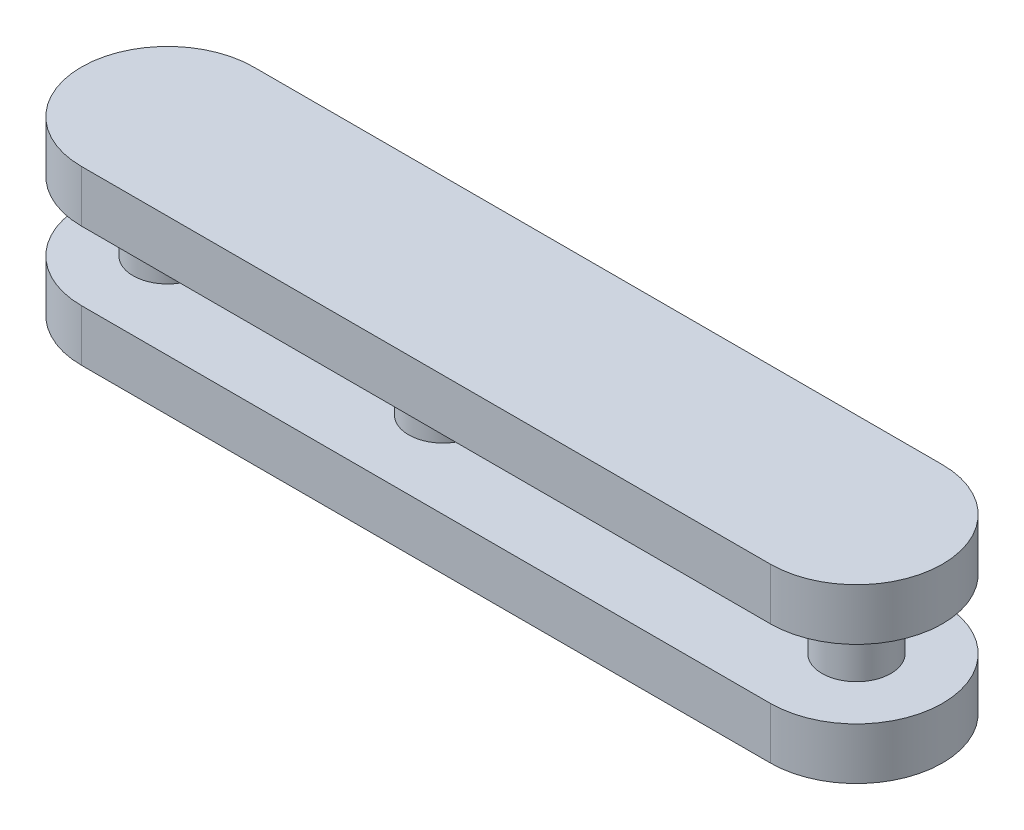
ISO-10303-21;
HEADER;
FILE_DESCRIPTION(('STEP AP214'),'2;1');
FILE_NAME('part.step','',(''),(''),'','','');
FILE_SCHEMA(('AUTOMOTIVE_DESIGN { 1 0 10303 214 1 1 1 1 }'));
ENDSEC;
DATA;
#1=APPLICATION_CONTEXT('core data for automotive mechanical design processes');
#2=APPLICATION_PROTOCOL_DEFINITION('international standard','automotive_design',2000,#1);
#3=PRODUCT_CONTEXT('',#1,'mechanical');
#4=PRODUCT('Part','Part','',(#3));
#5=PRODUCT_RELATED_PRODUCT_CATEGORY('part','',(#4));
#6=PRODUCT_DEFINITION_FORMATION('','',#4);
#7=PRODUCT_DEFINITION_CONTEXT('part definition',#1,'design');
#8=PRODUCT_DEFINITION('design','',#6,#7);
#9=PRODUCT_DEFINITION_SHAPE('','',#8);
#10=(LENGTH_UNIT() NAMED_UNIT(*) SI_UNIT(.MILLI.,.METRE.));
#11=(NAMED_UNIT(*) PLANE_ANGLE_UNIT() SI_UNIT($,.RADIAN.));
#12=(NAMED_UNIT(*) SI_UNIT($,.STERADIAN.) SOLID_ANGLE_UNIT());
#13=UNCERTAINTY_MEASURE_WITH_UNIT(LENGTH_MEASURE(1.E-05),#10,'distance_accuracy_value','');
#14=(GEOMETRIC_REPRESENTATION_CONTEXT(3) GLOBAL_UNCERTAINTY_ASSIGNED_CONTEXT((#13)) GLOBAL_UNIT_ASSIGNED_CONTEXT((#10,
#11,#12)) REPRESENTATION_CONTEXT('',''));
#15=CARTESIAN_POINT('',(0.,0.,0.));
#16=DIRECTION('',(0.,0.,1.));
#17=DIRECTION('',(1.,0.,0.));
#18=AXIS2_PLACEMENT_3D('',#15,#16,#17);
#19=CARTESIAN_POINT('',(21.,2.,-5.));
#20=DIRECTION('',(0.,1.,0.));
#21=DIRECTION('',(0.,0.,1.));
#22=AXIS2_PLACEMENT_3D('',#19,#20,#21);
#23=CYLINDRICAL_SURFACE('',#22,2.);
#24=CARTESIAN_POINT('',(21.,7.,-5.));
#25=DIRECTION('',(0.,1.,0.));
#26=DIRECTION('',(0.,0.,1.));
#27=AXIS2_PLACEMENT_3D('',#24,#25,#26);
#28=CIRCLE('',#27,2.);
#29=CARTESIAN_POINT('',(21.,7.,-3.));
#30=VERTEX_POINT('',#29);
#31=EDGE_CURVE('E41',#30,#30,#28,.F.);
#32=ORIENTED_EDGE('',*,*,#31,.T.);
#33=EDGE_LOOP('',(#32));
#34=FACE_BOUND('',#33,.T.);
#35=CARTESIAN_POINT('',(21.,3.,-5.));
#36=DIRECTION('',(0.,-1.,0.));
#37=DIRECTION('',(1.,0.,0.));
#38=AXIS2_PLACEMENT_3D('',#35,#36,#37);
#39=CIRCLE('',#38,2.);
#40=CARTESIAN_POINT('',(23.,3.,-5.));
#41=VERTEX_POINT('',#40);
#42=EDGE_CURVE('E11',#41,#41,#39,.T.);
#43=ORIENTED_EDGE('',*,*,#42,.F.);
#44=EDGE_LOOP('',(#43));
#45=FACE_BOUND('',#44,.T.);
#46=ADVANCED_FACE('F33',(#34,#45),#23,.T.);
#47=CARTESIAN_POINT('',(0.,10.,0.));
#48=DIRECTION('',(0.,0.,-1.));
#49=DIRECTION('',(-1.,0.,0.));
#50=AXIS2_PLACEMENT_3D('',#47,#48,#49);
#51=PLANE('',#50);
#52=DIRECTION('',(1.,0.,0.));
#53=VECTOR('',#52,1.);
#54=CARTESIAN_POINT('',(0.,10.,0.));
#55=LINE('',#54,#53);
#56=CARTESIAN_POINT('',(5.,10.,0.));
#57=VERTEX_POINT('',#56);
#58=CARTESIAN_POINT('',(45.,10.,0.));
#59=VERTEX_POINT('',#58);
#60=EDGE_CURVE('E153',#57,#59,#55,.T.);
#61=ORIENTED_EDGE('',*,*,#60,.F.);
#62=DIRECTION('',(0.,1.,0.));
#63=VECTOR('',#62,1.);
#64=CARTESIAN_POINT('',(5.,0.,0.));
#65=LINE('',#64,#63);
#66=CARTESIAN_POINT('',(5.,7.,0.));
#67=VERTEX_POINT('',#66);
#68=EDGE_CURVE('E135',#67,#57,#65,.T.);
#69=ORIENTED_EDGE('',*,*,#68,.F.);
#70=DIRECTION('',(-1.,0.,0.));
#71=VECTOR('',#70,1.);
#72=CARTESIAN_POINT('',(0.,7.,0.));
#73=LINE('',#72,#71);
#74=CARTESIAN_POINT('',(45.,7.,0.));
#75=VERTEX_POINT('',#74);
#76=EDGE_CURVE('E152',#75,#67,#73,.T.);
#77=ORIENTED_EDGE('',*,*,#76,.F.);
#78=DIRECTION('',(0.,1.,0.));
#79=VECTOR('',#78,1.);
#80=CARTESIAN_POINT('',(45.,0.,0.));
#81=LINE('',#80,#79);
#82=EDGE_CURVE('E56',#75,#59,#81,.T.);
#83=ORIENTED_EDGE('',*,*,#82,.T.);
#84=EDGE_LOOP('',(#61,#69,#77,#83));
#85=FACE_BOUND('',#84,.T.);
#86=ADVANCED_FACE('F35',(#85),#51,.F.);
#87=CARTESIAN_POINT('',(0.,10.,-10.));
#88=DIRECTION('',(0.,0.,1.));
#89=DIRECTION('',(1.,0.,0.));
#90=AXIS2_PLACEMENT_3D('',#87,#88,#89);
#91=PLANE('',#90);
#92=DIRECTION('',(0.,1.,0.));
#93=VECTOR('',#92,1.);
#94=CARTESIAN_POINT('',(5.,0.,-10.));
#95=LINE('',#94,#93);
#96=CARTESIAN_POINT('',(5.,6.99999999999999,-10.));
#97=VERTEX_POINT('',#96);
#98=CARTESIAN_POINT('',(5.,10.,-10.));
#99=VERTEX_POINT('',#98);
#100=EDGE_CURVE('E48',#97,#99,#95,.T.);
#101=ORIENTED_EDGE('',*,*,#100,.T.);
#102=DIRECTION('',(-1.,0.,0.));
#103=VECTOR('',#102,1.);
#104=CARTESIAN_POINT('',(0.,10.,-10.));
#105=LINE('',#104,#103);
#106=CARTESIAN_POINT('',(45.,10.,-10.));
#107=VERTEX_POINT('',#106);
#108=EDGE_CURVE('E149',#107,#99,#105,.T.);
#109=ORIENTED_EDGE('',*,*,#108,.F.);
#110=DIRECTION('',(0.,1.,0.));
#111=VECTOR('',#110,1.);
#112=CARTESIAN_POINT('',(45.,0.,-10.));
#113=LINE('',#112,#111);
#114=CARTESIAN_POINT('',(45.,7.,-10.));
#115=VERTEX_POINT('',#114);
#116=EDGE_CURVE('E134',#115,#107,#113,.T.);
#117=ORIENTED_EDGE('',*,*,#116,.F.);
#118=DIRECTION('',(-1.,0.,0.));
#119=VECTOR('',#118,1.);
#120=CARTESIAN_POINT('',(50.,7.,-10.));
#121=LINE('',#120,#119);
#122=EDGE_CURVE('E138',#115,#97,#121,.T.);
#123=ORIENTED_EDGE('',*,*,#122,.T.);
#124=EDGE_LOOP('',(#101,#109,#117,#123));
#125=FACE_BOUND('',#124,.T.);
#126=ADVANCED_FACE('F193',(#125),#91,.F.);
#127=CARTESIAN_POINT('',(0.,10.,0.));
#128=DIRECTION('',(0.,-1.,0.));
#129=DIRECTION('',(0.,0.,-1.));
#130=AXIS2_PLACEMENT_3D('',#127,#128,#129);
#131=PLANE('',#130);
#132=ORIENTED_EDGE('',*,*,#108,.T.);
#133=CARTESIAN_POINT('',(5.,10.,-5.));
#134=DIRECTION('',(0.,-1.,0.));
#135=DIRECTION('',(0.,0.,1.));
#136=AXIS2_PLACEMENT_3D('',#133,#134,#135);
#137=CIRCLE('',#136,5.);
#138=EDGE_CURVE('E132',#57,#99,#137,.T.);
#139=ORIENTED_EDGE('',*,*,#138,.F.);
#140=ORIENTED_EDGE('',*,*,#60,.T.);
#141=CARTESIAN_POINT('',(45.,10.,-5.));
#142=DIRECTION('',(0.,-1.,0.));
#143=DIRECTION('',(0.,0.,-1.));
#144=AXIS2_PLACEMENT_3D('',#141,#142,#143);
#145=CIRCLE('',#144,5.);
#146=EDGE_CURVE('E140',#107,#59,#145,.T.);
#147=ORIENTED_EDGE('',*,*,#146,.F.);
#148=EDGE_LOOP('',(#132,#139,#140,#147));
#149=FACE_BOUND('',#148,.T.);
#150=ADVANCED_FACE('F178',(#149),#131,.F.);
#151=CARTESIAN_POINT('',(0.,7.,-10.));
#152=DIRECTION('',(0.,1.,0.));
#153=DIRECTION('',(0.,0.,1.));
#154=AXIS2_PLACEMENT_3D('',#151,#152,#153);
#155=PLANE('',#154);
#156=ORIENTED_EDGE('',*,*,#31,.F.);
#157=EDGE_LOOP('',(#156));
#158=FACE_BOUND('',#157,.T.);
#159=CARTESIAN_POINT('',(45.,7.,-5.));
#160=DIRECTION('',(0.,1.,0.));
#161=DIRECTION('',(0.,0.,1.));
#162=AXIS2_PLACEMENT_3D('',#159,#160,#161);
#163=CIRCLE('',#162,2.);
#164=CARTESIAN_POINT('',(45.,7.,-3.));
#165=VERTEX_POINT('',#164);
#166=EDGE_CURVE('E163',#165,#165,#163,.F.);
#167=ORIENTED_EDGE('',*,*,#166,.F.);
#168=EDGE_LOOP('',(#167));
#169=FACE_BOUND('',#168,.T.);
#170=CARTESIAN_POINT('',(5.,7.,-5.));
#171=DIRECTION('',(0.,1.,0.));
#172=DIRECTION('',(0.,0.,1.));
#173=AXIS2_PLACEMENT_3D('',#170,#171,#172);
#174=CIRCLE('',#173,2.);
#175=CARTESIAN_POINT('',(5.,7.,-3.));
#176=VERTEX_POINT('',#175);
#177=EDGE_CURVE('E158',#176,#176,#174,.F.);
#178=ORIENTED_EDGE('',*,*,#177,.F.);
#179=EDGE_LOOP('',(#178));
#180=FACE_BOUND('',#179,.T.);
#181=ORIENTED_EDGE('',*,*,#76,.T.);
#182=CARTESIAN_POINT('',(5.,7.,-5.));
#183=DIRECTION('',(0.,1.,0.));
#184=DIRECTION('',(0.,0.,1.));
#185=AXIS2_PLACEMENT_3D('',#182,#183,#184);
#186=CIRCLE('',#185,5.);
#187=EDGE_CURVE('E168',#67,#97,#186,.F.);
#188=ORIENTED_EDGE('',*,*,#187,.T.);
#189=ORIENTED_EDGE('',*,*,#122,.F.);
#190=CARTESIAN_POINT('',(45.,7.,-5.));
#191=DIRECTION('',(0.,1.,0.));
#192=DIRECTION('',(0.,0.,1.));
#193=AXIS2_PLACEMENT_3D('',#190,#191,#192);
#194=CIRCLE('',#193,5.);
#195=EDGE_CURVE('E166',#115,#75,#194,.F.);
#196=ORIENTED_EDGE('',*,*,#195,.T.);
#197=EDGE_LOOP('',(#181,#188,#189,#196));
#198=FACE_BOUND('',#197,.T.);
#199=ADVANCED_FACE('F174',(#158,#169,#180,#198),#155,.F.);
#200=CARTESIAN_POINT('',(5.,7.99999999999999,-5.));
#201=DIRECTION('',(0.,-1.,0.));
#202=DIRECTION('',(0.,0.,-1.));
#203=AXIS2_PLACEMENT_3D('',#200,#201,#202);
#204=CYLINDRICAL_SURFACE('',#203,2.);
#205=CARTESIAN_POINT('',(5.,2.99999999999999,-5.));
#206=DIRECTION('',(0.,1.,0.));
#207=DIRECTION('',(0.,0.,1.));
#208=AXIS2_PLACEMENT_3D('',#205,#206,#207);
#209=CIRCLE('',#208,2.);
#210=CARTESIAN_POINT('',(5.,2.99999999999999,-3.));
#211=VERTEX_POINT('',#210);
#212=EDGE_CURVE('E142',#211,#211,#209,.T.);
#213=ORIENTED_EDGE('',*,*,#212,.T.);
#214=EDGE_LOOP('',(#213));
#215=FACE_BOUND('',#214,.T.);
#216=ORIENTED_EDGE('',*,*,#177,.T.);
#217=EDGE_LOOP('',(#216));
#218=FACE_BOUND('',#217,.T.);
#219=ADVANCED_FACE('F177',(#215,#218),#204,.T.);
#220=CARTESIAN_POINT('',(45.,7.99999999999999,-5.));
#221=DIRECTION('',(0.,-1.,0.));
#222=DIRECTION('',(0.,0.,-1.));
#223=AXIS2_PLACEMENT_3D('',#220,#221,#222);
#224=CYLINDRICAL_SURFACE('',#223,2.);
#225=CARTESIAN_POINT('',(45.,2.99999999999999,-5.));
#226=DIRECTION('',(0.,1.,0.));
#227=DIRECTION('',(0.,0.,1.));
#228=AXIS2_PLACEMENT_3D('',#225,#226,#227);
#229=CIRCLE('',#228,2.);
#230=CARTESIAN_POINT('',(45.,2.99999999999999,-3.));
#231=VERTEX_POINT('',#230);
#232=EDGE_CURVE('E131',#231,#231,#229,.T.);
#233=ORIENTED_EDGE('',*,*,#232,.T.);
#234=EDGE_LOOP('',(#233));
#235=FACE_BOUND('',#234,.T.);
#236=ORIENTED_EDGE('',*,*,#166,.T.);
#237=EDGE_LOOP('',(#236));
#238=FACE_BOUND('',#237,.T.);
#239=ADVANCED_FACE('F198',(#235,#238),#224,.T.);
#240=CARTESIAN_POINT('',(45.,0.,-5.));
#241=DIRECTION('',(0.,1.,0.));
#242=DIRECTION('',(0.,0.,1.));
#243=AXIS2_PLACEMENT_3D('',#240,#241,#242);
#244=CYLINDRICAL_SURFACE('',#243,5.);
#245=ORIENTED_EDGE('',*,*,#146,.T.);
#246=ORIENTED_EDGE('',*,*,#82,.F.);
#247=ORIENTED_EDGE('',*,*,#195,.F.);
#248=ORIENTED_EDGE('',*,*,#116,.T.);
#249=EDGE_LOOP('',(#245,#246,#247,#248));
#250=FACE_BOUND('',#249,.T.);
#251=ADVANCED_FACE('F196',(#250),#244,.T.);
#252=CARTESIAN_POINT('',(5.,0.,-5.));
#253=DIRECTION('',(0.,1.,0.));
#254=DIRECTION('',(0.,0.,1.));
#255=AXIS2_PLACEMENT_3D('',#252,#253,#254);
#256=CYLINDRICAL_SURFACE('',#255,5.);
#257=ORIENTED_EDGE('',*,*,#138,.T.);
#258=ORIENTED_EDGE('',*,*,#100,.F.);
#259=ORIENTED_EDGE('',*,*,#187,.F.);
#260=ORIENTED_EDGE('',*,*,#68,.T.);
#261=EDGE_LOOP('',(#257,#258,#259,#260));
#262=FACE_BOUND('',#261,.T.);
#263=ADVANCED_FACE('F189',(#262),#256,.T.);
#264=CARTESIAN_POINT('',(50.,3.,-10.));
#265=DIRECTION('',(0.,-1.,0.));
#266=DIRECTION('',(1.,0.,0.));
#267=AXIS2_PLACEMENT_3D('',#264,#265,#266);
#268=PLANE('',#267);
#269=ORIENTED_EDGE('',*,*,#42,.T.);
#270=EDGE_LOOP('',(#269));
#271=FACE_BOUND('',#270,.T.);
#272=DIRECTION('',(1.,0.,0.));
#273=VECTOR('',#272,1.);
#274=CARTESIAN_POINT('',(0.,3.,-10.));
#275=LINE('',#274,#273);
#276=CARTESIAN_POINT('',(5.,2.99999999999999,-10.));
#277=VERTEX_POINT('',#276);
#278=CARTESIAN_POINT('',(45.,3.,-10.));
#279=VERTEX_POINT('',#278);
#280=EDGE_CURVE('E126',#277,#279,#275,.T.);
#281=ORIENTED_EDGE('',*,*,#280,.F.);
#282=CARTESIAN_POINT('',(5.,2.99999999999999,-5.));
#283=DIRECTION('',(0.,-1.,0.));
#284=DIRECTION('',(1.,0.,0.));
#285=AXIS2_PLACEMENT_3D('',#282,#283,#284);
#286=CIRCLE('',#285,5.);
#287=CARTESIAN_POINT('',(5.,2.99999999999999,0.));
#288=VERTEX_POINT('',#287);
#289=EDGE_CURVE('E103',#277,#288,#286,.F.);
#290=ORIENTED_EDGE('',*,*,#289,.T.);
#291=DIRECTION('',(1.,0.,0.));
#292=VECTOR('',#291,1.);
#293=CARTESIAN_POINT('',(50.,3.,0.));
#294=LINE('',#293,#292);
#295=CARTESIAN_POINT('',(45.,3.,0.));
#296=VERTEX_POINT('',#295);
#297=EDGE_CURVE('E342',#288,#296,#294,.T.);
#298=ORIENTED_EDGE('',*,*,#297,.T.);
#299=CARTESIAN_POINT('',(45.,3.,-5.));
#300=DIRECTION('',(0.,-1.,0.));
#301=DIRECTION('',(1.,0.,0.));
#302=AXIS2_PLACEMENT_3D('',#299,#300,#301);
#303=CIRCLE('',#302,5.);
#304=EDGE_CURVE('E123',#296,#279,#303,.F.);
#305=ORIENTED_EDGE('',*,*,#304,.T.);
#306=EDGE_LOOP('',(#281,#290,#298,#305));
#307=FACE_BOUND('',#306,.T.);
#308=ORIENTED_EDGE('',*,*,#232,.F.);
#309=EDGE_LOOP('',(#308));
#310=FACE_BOUND('',#309,.T.);
#311=ORIENTED_EDGE('',*,*,#212,.F.);
#312=EDGE_LOOP('',(#311));
#313=FACE_BOUND('',#312,.T.);
#314=ADVANCED_FACE('F204',(#271,#307,#310,#313),#268,.F.);
#315=CARTESIAN_POINT('',(0.,10.,-10.));
#316=DIRECTION('',(0.,0.,1.));
#317=DIRECTION('',(1.,0.,0.));
#318=AXIS2_PLACEMENT_3D('',#315,#316,#317);
#319=PLANE('',#318);
#320=DIRECTION('',(0.,1.,0.));
#321=VECTOR('',#320,1.);
#322=CARTESIAN_POINT('',(5.,0.,-10.));
#323=LINE('',#322,#321);
#324=CARTESIAN_POINT('',(5.,0.,-10.));
#325=VERTEX_POINT('',#324);
#326=EDGE_CURVE('E97',#325,#277,#323,.T.);
#327=ORIENTED_EDGE('',*,*,#326,.T.);
#328=ORIENTED_EDGE('',*,*,#280,.T.);
#329=DIRECTION('',(0.,1.,0.));
#330=VECTOR('',#329,1.);
#331=CARTESIAN_POINT('',(45.,0.,-10.));
#332=LINE('',#331,#330);
#333=CARTESIAN_POINT('',(45.,0.,-10.));
#334=VERTEX_POINT('',#333);
#335=EDGE_CURVE('E118',#334,#279,#332,.T.);
#336=ORIENTED_EDGE('',*,*,#335,.F.);
#337=DIRECTION('',(-1.,0.,0.));
#338=VECTOR('',#337,1.);
#339=CARTESIAN_POINT('',(0.,0.,-10.));
#340=LINE('',#339,#338);
#341=EDGE_CURVE('E115',#334,#325,#340,.T.);
#342=ORIENTED_EDGE('',*,*,#341,.T.);
#343=EDGE_LOOP('',(#327,#328,#336,#342));
#344=FACE_BOUND('',#343,.T.);
#345=ADVANCED_FACE('F121',(#344),#319,.F.);
#346=CARTESIAN_POINT('',(0.,10.,0.));
#347=DIRECTION('',(0.,0.,-1.));
#348=DIRECTION('',(-1.,0.,0.));
#349=AXIS2_PLACEMENT_3D('',#346,#347,#348);
#350=PLANE('',#349);
#351=ORIENTED_EDGE('',*,*,#297,.F.);
#352=DIRECTION('',(0.,1.,0.));
#353=VECTOR('',#352,1.);
#354=CARTESIAN_POINT('',(5.,0.,0.));
#355=LINE('',#354,#353);
#356=CARTESIAN_POINT('',(5.,0.,0.));
#357=VERTEX_POINT('',#356);
#358=EDGE_CURVE('E108',#357,#288,#355,.T.);
#359=ORIENTED_EDGE('',*,*,#358,.F.);
#360=DIRECTION('',(1.,0.,0.));
#361=VECTOR('',#360,1.);
#362=CARTESIAN_POINT('',(0.,0.,0.));
#363=LINE('',#362,#361);
#364=CARTESIAN_POINT('',(45.,0.,0.));
#365=VERTEX_POINT('',#364);
#366=EDGE_CURVE('E117',#357,#365,#363,.T.);
#367=ORIENTED_EDGE('',*,*,#366,.T.);
#368=DIRECTION('',(0.,1.,0.));
#369=VECTOR('',#368,1.);
#370=CARTESIAN_POINT('',(45.,0.,0.));
#371=LINE('',#370,#369);
#372=EDGE_CURVE('E338',#365,#296,#371,.T.);
#373=ORIENTED_EDGE('',*,*,#372,.T.);
#374=EDGE_LOOP('',(#351,#359,#367,#373));
#375=FACE_BOUND('',#374,.T.);
#376=ADVANCED_FACE('F214',(#375),#350,.F.);
#377=CARTESIAN_POINT('',(0.,0.,0.));
#378=DIRECTION('',(0.,-1.,0.));
#379=DIRECTION('',(0.,0.,-1.));
#380=AXIS2_PLACEMENT_3D('',#377,#378,#379);
#381=PLANE('',#380);
#382=CARTESIAN_POINT('',(5.,0.,-5.));
#383=DIRECTION('',(0.,-1.,0.));
#384=DIRECTION('',(0.,0.,1.));
#385=AXIS2_PLACEMENT_3D('',#382,#383,#384);
#386=CIRCLE('',#385,5.);
#387=EDGE_CURVE('E100',#357,#325,#386,.T.);
#388=ORIENTED_EDGE('',*,*,#387,.T.);
#389=ORIENTED_EDGE('',*,*,#341,.F.);
#390=CARTESIAN_POINT('',(45.,0.,-5.));
#391=DIRECTION('',(0.,-1.,0.));
#392=DIRECTION('',(0.,0.,-1.));
#393=AXIS2_PLACEMENT_3D('',#390,#391,#392);
#394=CIRCLE('',#393,5.);
#395=EDGE_CURVE('E343',#334,#365,#394,.T.);
#396=ORIENTED_EDGE('',*,*,#395,.T.);
#397=ORIENTED_EDGE('',*,*,#366,.F.);
#398=EDGE_LOOP('',(#388,#389,#396,#397));
#399=FACE_BOUND('',#398,.T.);
#400=ADVANCED_FACE('F113',(#399),#381,.T.);
#401=CARTESIAN_POINT('',(45.,0.,-5.));
#402=DIRECTION('',(0.,1.,0.));
#403=DIRECTION('',(0.,0.,1.));
#404=AXIS2_PLACEMENT_3D('',#401,#402,#403);
#405=CYLINDRICAL_SURFACE('',#404,5.);
#406=ORIENTED_EDGE('',*,*,#304,.F.);
#407=ORIENTED_EDGE('',*,*,#372,.F.);
#408=ORIENTED_EDGE('',*,*,#395,.F.);
#409=ORIENTED_EDGE('',*,*,#335,.T.);
#410=EDGE_LOOP('',(#406,#407,#408,#409));
#411=FACE_BOUND('',#410,.T.);
#412=ADVANCED_FACE('F222',(#411),#405,.T.);
#413=CARTESIAN_POINT('',(5.,0.,-5.));
#414=DIRECTION('',(0.,1.,0.));
#415=DIRECTION('',(0.,0.,1.));
#416=AXIS2_PLACEMENT_3D('',#413,#414,#415);
#417=CYLINDRICAL_SURFACE('',#416,5.);
#418=ORIENTED_EDGE('',*,*,#289,.F.);
#419=ORIENTED_EDGE('',*,*,#326,.F.);
#420=ORIENTED_EDGE('',*,*,#387,.F.);
#421=ORIENTED_EDGE('',*,*,#358,.T.);
#422=EDGE_LOOP('',(#418,#419,#420,#421));
#423=FACE_BOUND('',#422,.T.);
#424=ADVANCED_FACE('F99',(#423),#417,.T.);
#425=CLOSED_SHELL('',(#46,#86,#126,#150,#199,#219,#239,#251,#263,#314,#345,#376,#400,#412,#424));
#426=MANIFOLD_SOLID_BREP('B2',#425);
#427=ADVANCED_BREP_SHAPE_REPRESENTATION('',(#18,#426),#14);
#428=SHAPE_DEFINITION_REPRESENTATION(#9,#427);
ENDSEC;
END-ISO-10303-21;
